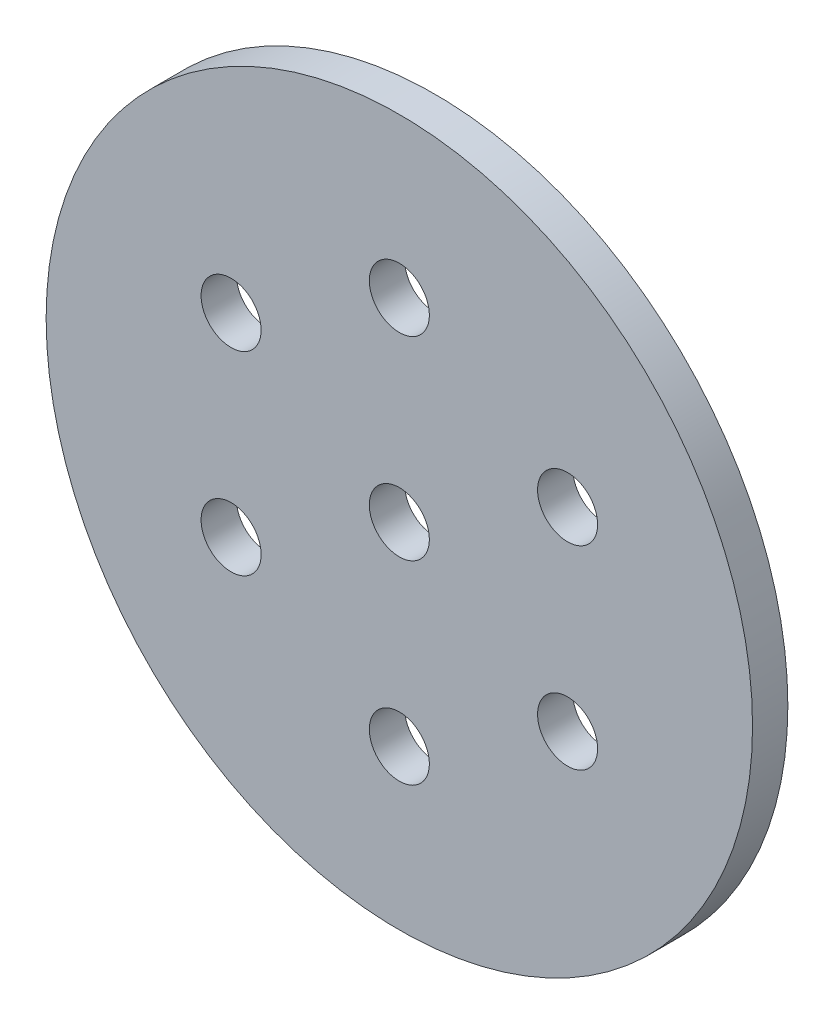
ISO-10303-21;
HEADER;
FILE_DESCRIPTION(('STEP AP214'),'2;1');
FILE_NAME('part.step','',(''),(''),'','','');
FILE_SCHEMA(('AUTOMOTIVE_DESIGN { 1 0 10303 214 1 1 1 1 }'));
ENDSEC;
DATA;
#1=APPLICATION_CONTEXT('core data for automotive mechanical design processes');
#2=APPLICATION_PROTOCOL_DEFINITION('international standard','automotive_design',2000,#1);
#3=PRODUCT_CONTEXT('',#1,'mechanical');
#4=PRODUCT('Part','Part','',(#3));
#5=PRODUCT_RELATED_PRODUCT_CATEGORY('part','',(#4));
#6=PRODUCT_DEFINITION_FORMATION('','',#4);
#7=PRODUCT_DEFINITION_CONTEXT('part definition',#1,'design');
#8=PRODUCT_DEFINITION('design','',#6,#7);
#9=PRODUCT_DEFINITION_SHAPE('','',#8);
#10=(LENGTH_UNIT() NAMED_UNIT(*) SI_UNIT(.MILLI.,.METRE.));
#11=(NAMED_UNIT(*) PLANE_ANGLE_UNIT() SI_UNIT($,.RADIAN.));
#12=(NAMED_UNIT(*) SI_UNIT($,.STERADIAN.) SOLID_ANGLE_UNIT());
#13=UNCERTAINTY_MEASURE_WITH_UNIT(LENGTH_MEASURE(1.E-05),#10,'distance_accuracy_value','');
#14=(GEOMETRIC_REPRESENTATION_CONTEXT(3) GLOBAL_UNCERTAINTY_ASSIGNED_CONTEXT((#13)) GLOBAL_UNIT_ASSIGNED_CONTEXT((#10,
#11,#12)) REPRESENTATION_CONTEXT('',''));
#15=CARTESIAN_POINT('',(0.,0.,0.));
#16=DIRECTION('',(0.,0.,1.));
#17=DIRECTION('',(1.,0.,0.));
#18=AXIS2_PLACEMENT_3D('',#15,#16,#17);
#19=CARTESIAN_POINT('',(0.,0.,10.));
#20=DIRECTION('',(0.,0.,1.));
#21=DIRECTION('',(1.,0.,0.));
#22=AXIS2_PLACEMENT_3D('',#19,#20,#21);
#23=PLANE('',#22);
#24=CARTESIAN_POINT('',(-47.6313972081387,-27.5000000000032,10.));
#25=DIRECTION('',(0.,0.,1.));
#26=DIRECTION('',(1.,0.,0.));
#27=AXIS2_PLACEMENT_3D('',#24,#25,#26);
#28=CIRCLE('',#27,8.50000000000002);
#29=CARTESIAN_POINT('',(-39.1313972081387,-27.5000000000032,10.));
#30=VERTEX_POINT('',#29);
#31=EDGE_CURVE('E88',#30,#30,#28,.T.);
#32=ORIENTED_EDGE('',*,*,#31,.F.);
#33=EDGE_LOOP('',(#32));
#34=FACE_BOUND('',#33,.T.);
#35=CARTESIAN_POINT('',(47.6313972081496,-27.4999999999968,10.));
#36=DIRECTION('',(0.,0.,1.));
#37=DIRECTION('',(1.,0.,0.));
#38=AXIS2_PLACEMENT_3D('',#35,#36,#37);
#39=CIRCLE('',#38,8.50000000000002);
#40=CARTESIAN_POINT('',(56.1313972081496,-27.4999999999968,10.));
#41=VERTEX_POINT('',#40);
#42=EDGE_CURVE('E72',#41,#41,#39,.T.);
#43=ORIENTED_EDGE('',*,*,#42,.F.);
#44=EDGE_LOOP('',(#43));
#45=FACE_BOUND('',#44,.T.);
#46=CARTESIAN_POINT('',(0.,55.,10.));
#47=DIRECTION('',(0.,0.,1.));
#48=DIRECTION('',(1.,0.,0.));
#49=AXIS2_PLACEMENT_3D('',#46,#47,#48);
#50=CIRCLE('',#49,8.5);
#51=CARTESIAN_POINT('',(8.5,55.,10.));
#52=VERTEX_POINT('',#51);
#53=EDGE_CURVE('E56',#52,#52,#50,.T.);
#54=ORIENTED_EDGE('',*,*,#53,.F.);
#55=EDGE_LOOP('',(#54));
#56=FACE_BOUND('',#55,.T.);
#57=CARTESIAN_POINT('',(0.,0.,10.));
#58=DIRECTION('',(0.,0.,1.));
#59=DIRECTION('',(1.,0.,0.));
#60=AXIS2_PLACEMENT_3D('',#57,#58,#59);
#61=CIRCLE('',#60,100.);
#62=CARTESIAN_POINT('',(100.,0.,10.));
#63=VERTEX_POINT('',#62);
#64=EDGE_CURVE('E10',#63,#63,#61,.T.);
#65=ORIENTED_EDGE('',*,*,#64,.T.);
#66=EDGE_LOOP('',(#65));
#67=FACE_BOUND('',#66,.T.);
#68=CARTESIAN_POINT('',(0.,0.,10.));
#69=DIRECTION('',(0.,0.,1.));
#70=DIRECTION('',(1.,0.,0.));
#71=AXIS2_PLACEMENT_3D('',#68,#69,#70);
#72=CIRCLE('',#71,8.5);
#73=CARTESIAN_POINT('',(8.5,0.,10.));
#74=VERTEX_POINT('',#73);
#75=EDGE_CURVE('E50',#74,#74,#72,.T.);
#76=ORIENTED_EDGE('',*,*,#75,.F.);
#77=EDGE_LOOP('',(#76));
#78=FACE_BOUND('',#77,.T.);
#79=CARTESIAN_POINT('',(47.6313972081459,27.5000000000032,10.));
#80=DIRECTION('',(0.,0.,1.));
#81=DIRECTION('',(1.,0.,0.));
#82=AXIS2_PLACEMENT_3D('',#79,#80,#81);
#83=CIRCLE('',#82,8.50000000000001);
#84=CARTESIAN_POINT('',(56.1313972081459,27.5000000000032,10.));
#85=VERTEX_POINT('',#84);
#86=EDGE_CURVE('E64',#85,#85,#83,.T.);
#87=ORIENTED_EDGE('',*,*,#86,.F.);
#88=EDGE_LOOP('',(#87));
#89=FACE_BOUND('',#88,.T.);
#90=CARTESIAN_POINT('',(7.26469883903724E-12,-55.,10.));
#91=DIRECTION('',(0.,0.,1.));
#92=DIRECTION('',(1.,0.,0.));
#93=AXIS2_PLACEMENT_3D('',#90,#91,#92);
#94=CIRCLE('',#93,8.5);
#95=CARTESIAN_POINT('',(8.50000000000727,-55.,10.));
#96=VERTEX_POINT('',#95);
#97=EDGE_CURVE('E80',#96,#96,#94,.T.);
#98=ORIENTED_EDGE('',*,*,#97,.F.);
#99=EDGE_LOOP('',(#98));
#100=FACE_BOUND('',#99,.T.);
#101=CARTESIAN_POINT('',(-47.6313972081423,27.4999999999968,10.));
#102=DIRECTION('',(0.,0.,1.));
#103=DIRECTION('',(1.,0.,0.));
#104=AXIS2_PLACEMENT_3D('',#101,#102,#103);
#105=CIRCLE('',#104,8.50000000000001);
#106=CARTESIAN_POINT('',(-39.1313972081423,27.4999999999968,10.));
#107=VERTEX_POINT('',#106);
#108=EDGE_CURVE('E96',#107,#107,#105,.T.);
#109=ORIENTED_EDGE('',*,*,#108,.F.);
#110=EDGE_LOOP('',(#109));
#111=FACE_BOUND('',#110,.T.);
#112=ADVANCED_FACE('F37',(#34,#45,#56,#67,#78,#89,#100,#111),#23,.T.);
#113=CARTESIAN_POINT('',(0.,0.,0.));
#114=DIRECTION('',(0.,0.,1.));
#115=DIRECTION('',(1.,0.,0.));
#116=AXIS2_PLACEMENT_3D('',#113,#114,#115);
#117=PLANE('',#116);
#118=CARTESIAN_POINT('',(0.,0.,0.));
#119=DIRECTION('',(0.,0.,1.));
#120=DIRECTION('',(1.,0.,0.));
#121=AXIS2_PLACEMENT_3D('',#118,#119,#120);
#122=CIRCLE('',#121,100.);
#123=CARTESIAN_POINT('',(100.,0.,0.));
#124=VERTEX_POINT('',#123);
#125=EDGE_CURVE('E41',#124,#124,#122,.T.);
#126=ORIENTED_EDGE('',*,*,#125,.F.);
#127=EDGE_LOOP('',(#126));
#128=FACE_BOUND('',#127,.T.);
#129=CARTESIAN_POINT('',(0.,0.,0.));
#130=DIRECTION('',(0.,0.,1.));
#131=DIRECTION('',(1.,0.,0.));
#132=AXIS2_PLACEMENT_3D('',#129,#130,#131);
#133=CIRCLE('',#132,8.5);
#134=CARTESIAN_POINT('',(8.5,0.,0.));
#135=VERTEX_POINT('',#134);
#136=EDGE_CURVE('E52',#135,#135,#133,.T.);
#137=ORIENTED_EDGE('',*,*,#136,.T.);
#138=EDGE_LOOP('',(#137));
#139=FACE_BOUND('',#138,.T.);
#140=CARTESIAN_POINT('',(0.,55.,0.));
#141=DIRECTION('',(0.,0.,1.));
#142=DIRECTION('',(1.,0.,0.));
#143=AXIS2_PLACEMENT_3D('',#140,#141,#142);
#144=CIRCLE('',#143,8.5);
#145=CARTESIAN_POINT('',(8.5,55.,0.));
#146=VERTEX_POINT('',#145);
#147=EDGE_CURVE('E60',#146,#146,#144,.T.);
#148=ORIENTED_EDGE('',*,*,#147,.T.);
#149=EDGE_LOOP('',(#148));
#150=FACE_BOUND('',#149,.T.);
#151=CARTESIAN_POINT('',(47.6313972081459,27.5000000000032,0.));
#152=DIRECTION('',(0.,0.,1.));
#153=DIRECTION('',(1.,0.,0.));
#154=AXIS2_PLACEMENT_3D('',#151,#152,#153);
#155=CIRCLE('',#154,8.50000000000001);
#156=CARTESIAN_POINT('',(56.1313972081459,27.5000000000032,0.));
#157=VERTEX_POINT('',#156);
#158=EDGE_CURVE('E68',#157,#157,#155,.T.);
#159=ORIENTED_EDGE('',*,*,#158,.T.);
#160=EDGE_LOOP('',(#159));
#161=FACE_BOUND('',#160,.T.);
#162=CARTESIAN_POINT('',(47.6313972081496,-27.4999999999968,0.));
#163=DIRECTION('',(0.,0.,1.));
#164=DIRECTION('',(1.,0.,0.));
#165=AXIS2_PLACEMENT_3D('',#162,#163,#164);
#166=CIRCLE('',#165,8.50000000000002);
#167=CARTESIAN_POINT('',(56.1313972081496,-27.4999999999968,0.));
#168=VERTEX_POINT('',#167);
#169=EDGE_CURVE('E76',#168,#168,#166,.T.);
#170=ORIENTED_EDGE('',*,*,#169,.T.);
#171=EDGE_LOOP('',(#170));
#172=FACE_BOUND('',#171,.T.);
#173=CARTESIAN_POINT('',(7.26469883903724E-12,-55.,0.));
#174=DIRECTION('',(0.,0.,1.));
#175=DIRECTION('',(1.,0.,0.));
#176=AXIS2_PLACEMENT_3D('',#173,#174,#175);
#177=CIRCLE('',#176,8.5);
#178=CARTESIAN_POINT('',(8.50000000000727,-55.,0.));
#179=VERTEX_POINT('',#178);
#180=EDGE_CURVE('E84',#179,#179,#177,.T.);
#181=ORIENTED_EDGE('',*,*,#180,.T.);
#182=EDGE_LOOP('',(#181));
#183=FACE_BOUND('',#182,.T.);
#184=CARTESIAN_POINT('',(-47.6313972081387,-27.5000000000032,0.));
#185=DIRECTION('',(0.,0.,1.));
#186=DIRECTION('',(1.,0.,0.));
#187=AXIS2_PLACEMENT_3D('',#184,#185,#186);
#188=CIRCLE('',#187,8.50000000000002);
#189=CARTESIAN_POINT('',(-39.1313972081387,-27.5000000000032,0.));
#190=VERTEX_POINT('',#189);
#191=EDGE_CURVE('E92',#190,#190,#188,.T.);
#192=ORIENTED_EDGE('',*,*,#191,.T.);
#193=EDGE_LOOP('',(#192));
#194=FACE_BOUND('',#193,.T.);
#195=CARTESIAN_POINT('',(-47.6313972081423,27.4999999999968,0.));
#196=DIRECTION('',(0.,0.,1.));
#197=DIRECTION('',(1.,0.,0.));
#198=AXIS2_PLACEMENT_3D('',#195,#196,#197);
#199=CIRCLE('',#198,8.50000000000001);
#200=CARTESIAN_POINT('',(-39.1313972081423,27.4999999999968,0.));
#201=VERTEX_POINT('',#200);
#202=EDGE_CURVE('E100',#201,#201,#199,.T.);
#203=ORIENTED_EDGE('',*,*,#202,.T.);
#204=EDGE_LOOP('',(#203));
#205=FACE_BOUND('',#204,.T.);
#206=ADVANCED_FACE('F112',(#128,#139,#150,#161,#172,#183,#194,#205),#117,.F.);
#207=CARTESIAN_POINT('',(0.,0.,10.));
#208=DIRECTION('',(0.,0.,-1.));
#209=DIRECTION('',(-1.,0.,0.));
#210=AXIS2_PLACEMENT_3D('',#207,#208,#209);
#211=CYLINDRICAL_SURFACE('',#210,100.);
#212=ORIENTED_EDGE('',*,*,#64,.F.);
#213=EDGE_LOOP('',(#212));
#214=FACE_BOUND('',#213,.T.);
#215=ORIENTED_EDGE('',*,*,#125,.T.);
#216=EDGE_LOOP('',(#215));
#217=FACE_BOUND('',#216,.T.);
#218=ADVANCED_FACE('F39',(#214,#217),#211,.T.);
#219=CARTESIAN_POINT('',(0.,0.,10.));
#220=DIRECTION('',(0.,0.,-1.));
#221=DIRECTION('',(-1.,0.,0.));
#222=AXIS2_PLACEMENT_3D('',#219,#220,#221);
#223=CYLINDRICAL_SURFACE('',#222,8.5);
#224=ORIENTED_EDGE('',*,*,#75,.T.);
#225=EDGE_LOOP('',(#224));
#226=FACE_BOUND('',#225,.T.);
#227=ORIENTED_EDGE('',*,*,#136,.F.);
#228=EDGE_LOOP('',(#227));
#229=FACE_BOUND('',#228,.T.);
#230=ADVANCED_FACE('F122',(#226,#229),#223,.F.);
#231=CARTESIAN_POINT('',(0.,55.,10.));
#232=DIRECTION('',(0.,0.,-1.));
#233=DIRECTION('',(-1.,0.,0.));
#234=AXIS2_PLACEMENT_3D('',#231,#232,#233);
#235=CYLINDRICAL_SURFACE('',#234,8.5);
#236=ORIENTED_EDGE('',*,*,#53,.T.);
#237=EDGE_LOOP('',(#236));
#238=FACE_BOUND('',#237,.T.);
#239=ORIENTED_EDGE('',*,*,#147,.F.);
#240=EDGE_LOOP('',(#239));
#241=FACE_BOUND('',#240,.T.);
#242=ADVANCED_FACE('F125',(#238,#241),#235,.F.);
#243=CARTESIAN_POINT('',(47.6313972081459,27.5000000000032,10.));
#244=DIRECTION('',(0.,0.,-1.));
#245=DIRECTION('',(-1.,0.,0.));
#246=AXIS2_PLACEMENT_3D('',#243,#244,#245);
#247=CYLINDRICAL_SURFACE('',#246,8.50000000000001);
#248=ORIENTED_EDGE('',*,*,#86,.T.);
#249=EDGE_LOOP('',(#248));
#250=FACE_BOUND('',#249,.T.);
#251=ORIENTED_EDGE('',*,*,#158,.F.);
#252=EDGE_LOOP('',(#251));
#253=FACE_BOUND('',#252,.T.);
#254=ADVANCED_FACE('F129',(#250,#253),#247,.F.);
#255=CARTESIAN_POINT('',(47.6313972081496,-27.4999999999968,10.));
#256=DIRECTION('',(0.,0.,-1.));
#257=DIRECTION('',(-1.,0.,0.));
#258=AXIS2_PLACEMENT_3D('',#255,#256,#257);
#259=CYLINDRICAL_SURFACE('',#258,8.50000000000002);
#260=ORIENTED_EDGE('',*,*,#42,.T.);
#261=EDGE_LOOP('',(#260));
#262=FACE_BOUND('',#261,.T.);
#263=ORIENTED_EDGE('',*,*,#169,.F.);
#264=EDGE_LOOP('',(#263));
#265=FACE_BOUND('',#264,.T.);
#266=ADVANCED_FACE('F133',(#262,#265),#259,.F.);
#267=CARTESIAN_POINT('',(7.26469883903724E-12,-55.,10.));
#268=DIRECTION('',(0.,0.,-1.));
#269=DIRECTION('',(-1.,0.,0.));
#270=AXIS2_PLACEMENT_3D('',#267,#268,#269);
#271=CYLINDRICAL_SURFACE('',#270,8.5);
#272=ORIENTED_EDGE('',*,*,#97,.T.);
#273=EDGE_LOOP('',(#272));
#274=FACE_BOUND('',#273,.T.);
#275=ORIENTED_EDGE('',*,*,#180,.F.);
#276=EDGE_LOOP('',(#275));
#277=FACE_BOUND('',#276,.T.);
#278=ADVANCED_FACE('F137',(#274,#277),#271,.F.);
#279=CARTESIAN_POINT('',(-47.6313972081387,-27.5000000000032,10.));
#280=DIRECTION('',(0.,0.,-1.));
#281=DIRECTION('',(-1.,0.,0.));
#282=AXIS2_PLACEMENT_3D('',#279,#280,#281);
#283=CYLINDRICAL_SURFACE('',#282,8.50000000000002);
#284=ORIENTED_EDGE('',*,*,#31,.T.);
#285=EDGE_LOOP('',(#284));
#286=FACE_BOUND('',#285,.T.);
#287=ORIENTED_EDGE('',*,*,#191,.F.);
#288=EDGE_LOOP('',(#287));
#289=FACE_BOUND('',#288,.T.);
#290=ADVANCED_FACE('F141',(#286,#289),#283,.F.);
#291=CARTESIAN_POINT('',(-47.6313972081423,27.4999999999968,10.));
#292=DIRECTION('',(0.,0.,-1.));
#293=DIRECTION('',(-1.,0.,0.));
#294=AXIS2_PLACEMENT_3D('',#291,#292,#293);
#295=CYLINDRICAL_SURFACE('',#294,8.50000000000001);
#296=ORIENTED_EDGE('',*,*,#108,.T.);
#297=EDGE_LOOP('',(#296));
#298=FACE_BOUND('',#297,.T.);
#299=ORIENTED_EDGE('',*,*,#202,.F.);
#300=EDGE_LOOP('',(#299));
#301=FACE_BOUND('',#300,.T.);
#302=ADVANCED_FACE('F108',(#298,#301),#295,.F.);
#303=CLOSED_SHELL('',(#112,#206,#218,#230,#242,#254,#266,#278,#290,#302));
#304=MANIFOLD_SOLID_BREP('B2',#303);
#305=ADVANCED_BREP_SHAPE_REPRESENTATION('',(#18,#304),#14);
#306=SHAPE_DEFINITION_REPRESENTATION(#9,#305);
ENDSEC;
END-ISO-10303-21;
